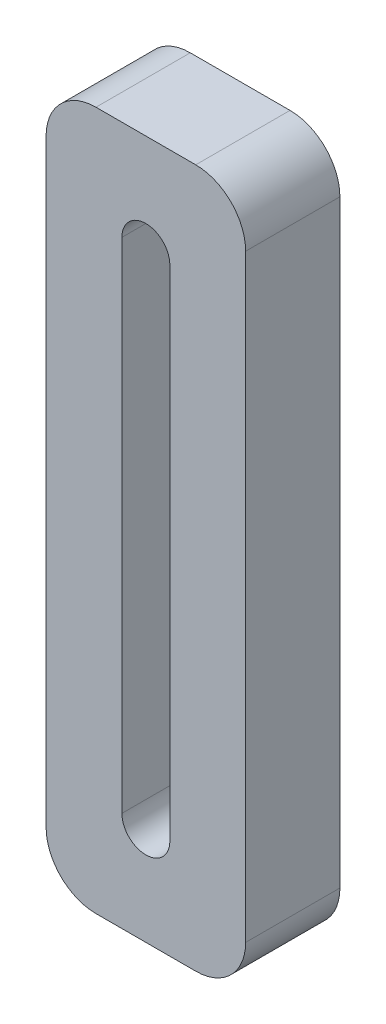
ISO-10303-21;
HEADER;
FILE_DESCRIPTION(('STEP AP214'),'2;1');
FILE_NAME('part.step','',(''),(''),'','','');
FILE_SCHEMA(('AUTOMOTIVE_DESIGN { 1 0 10303 214 1 1 1 1 }'));
ENDSEC;
DATA;
#1=APPLICATION_CONTEXT('core data for automotive mechanical design processes');
#2=APPLICATION_PROTOCOL_DEFINITION('international standard','automotive_design',2000,#1);
#3=PRODUCT_CONTEXT('',#1,'mechanical');
#4=PRODUCT('Part','Part','',(#3));
#5=PRODUCT_RELATED_PRODUCT_CATEGORY('part','',(#4));
#6=PRODUCT_DEFINITION_FORMATION('','',#4);
#7=PRODUCT_DEFINITION_CONTEXT('part definition',#1,'design');
#8=PRODUCT_DEFINITION('design','',#6,#7);
#9=PRODUCT_DEFINITION_SHAPE('','',#8);
#10=(LENGTH_UNIT() NAMED_UNIT(*) SI_UNIT(.MILLI.,.METRE.));
#11=(NAMED_UNIT(*) PLANE_ANGLE_UNIT() SI_UNIT($,.RADIAN.));
#12=(NAMED_UNIT(*) SI_UNIT($,.STERADIAN.) SOLID_ANGLE_UNIT());
#13=UNCERTAINTY_MEASURE_WITH_UNIT(LENGTH_MEASURE(1.E-05),#10,'distance_accuracy_value','');
#14=(GEOMETRIC_REPRESENTATION_CONTEXT(3) GLOBAL_UNCERTAINTY_ASSIGNED_CONTEXT((#13)) GLOBAL_UNIT_ASSIGNED_CONTEXT((#10,
#11,#12)) REPRESENTATION_CONTEXT('',''));
#15=CARTESIAN_POINT('',(0.,0.,0.));
#16=DIRECTION('',(0.,0.,1.));
#17=DIRECTION('',(1.,0.,0.));
#18=AXIS2_PLACEMENT_3D('',#15,#16,#17);
#19=CARTESIAN_POINT('',(0.,0.,3.));
#20=DIRECTION('',(0.,0.,-1.));
#21=DIRECTION('',(-1.,0.,0.));
#22=AXIS2_PLACEMENT_3D('',#19,#20,#21);
#23=PLANE('',#22);
#24=DIRECTION('',(1.,0.,0.));
#25=VECTOR('',#24,1.);
#26=CARTESIAN_POINT('',(-6.35,-22.225,3.));
#27=LINE('',#26,#25);
#28=CARTESIAN_POINT('',(-3.175,-22.225,3.));
#29=VERTEX_POINT('',#28);
#30=CARTESIAN_POINT('',(3.175,-22.225,3.));
#31=VERTEX_POINT('',#30);
#32=EDGE_CURVE('E185',#29,#31,#27,.T.);
#33=ORIENTED_EDGE('',*,*,#32,.T.);
#34=CARTESIAN_POINT('',(3.175,-19.05,3.));
#35=DIRECTION('',(0.,0.,-1.));
#36=DIRECTION('',(-1.,0.,0.));
#37=AXIS2_PLACEMENT_3D('',#34,#35,#36);
#38=CIRCLE('',#37,3.175);
#39=CARTESIAN_POINT('',(6.35,-19.05,3.));
#40=VERTEX_POINT('',#39);
#41=EDGE_CURVE('E220',#31,#40,#38,.F.);
#42=ORIENTED_EDGE('',*,*,#41,.T.);
#43=DIRECTION('',(0.,1.,0.));
#44=VECTOR('',#43,1.);
#45=CARTESIAN_POINT('',(6.35,-22.225,3.));
#46=LINE('',#45,#44);
#47=CARTESIAN_POINT('',(6.35,19.05,3.));
#48=VERTEX_POINT('',#47);
#49=EDGE_CURVE('E196',#40,#48,#46,.T.);
#50=ORIENTED_EDGE('',*,*,#49,.T.);
#51=CARTESIAN_POINT('',(3.175,19.05,3.));
#52=DIRECTION('',(0.,0.,-1.));
#53=DIRECTION('',(-1.,0.,0.));
#54=AXIS2_PLACEMENT_3D('',#51,#52,#53);
#55=CIRCLE('',#54,3.175);
#56=CARTESIAN_POINT('',(3.175,22.225,3.));
#57=VERTEX_POINT('',#56);
#58=EDGE_CURVE('E221',#48,#57,#55,.F.);
#59=ORIENTED_EDGE('',*,*,#58,.T.);
#60=DIRECTION('',(-1.,0.,0.));
#61=VECTOR('',#60,1.);
#62=CARTESIAN_POINT('',(-6.35,22.225,3.));
#63=LINE('',#62,#61);
#64=CARTESIAN_POINT('',(-3.175,22.225,3.));
#65=VERTEX_POINT('',#64);
#66=EDGE_CURVE('E186',#57,#65,#63,.T.);
#67=ORIENTED_EDGE('',*,*,#66,.T.);
#68=CARTESIAN_POINT('',(-3.175,19.05,3.));
#69=DIRECTION('',(0.,0.,-1.));
#70=DIRECTION('',(-1.,0.,0.));
#71=AXIS2_PLACEMENT_3D('',#68,#69,#70);
#72=CIRCLE('',#71,3.175);
#73=CARTESIAN_POINT('',(-6.35,19.05,3.));
#74=VERTEX_POINT('',#73);
#75=EDGE_CURVE('E69',#65,#74,#72,.F.);
#76=ORIENTED_EDGE('',*,*,#75,.T.);
#77=DIRECTION('',(0.,-1.,0.));
#78=VECTOR('',#77,1.);
#79=CARTESIAN_POINT('',(-6.35,-22.225,3.));
#80=LINE('',#79,#78);
#81=CARTESIAN_POINT('',(-6.35,-19.05,3.));
#82=VERTEX_POINT('',#81);
#83=EDGE_CURVE('E181',#74,#82,#80,.T.);
#84=ORIENTED_EDGE('',*,*,#83,.T.);
#85=CARTESIAN_POINT('',(-3.175,-19.05,3.));
#86=DIRECTION('',(0.,0.,-1.));
#87=DIRECTION('',(-1.,0.,0.));
#88=AXIS2_PLACEMENT_3D('',#85,#86,#87);
#89=CIRCLE('',#88,3.175);
#90=EDGE_CURVE('E219',#82,#29,#89,.F.);
#91=ORIENTED_EDGE('',*,*,#90,.T.);
#92=EDGE_LOOP('',(#33,#42,#50,#59,#67,#76,#84,#91));
#93=FACE_BOUND('',#92,.T.);
#94=CARTESIAN_POINT('',(0.,15.875,3.));
#95=DIRECTION('',(0.,0.,1.));
#96=DIRECTION('',(1.,0.,0.));
#97=AXIS2_PLACEMENT_3D('',#94,#95,#96);
#98=CIRCLE('',#97,1.52690839694655);
#99=CARTESIAN_POINT('',(1.52690839694655,15.875,3.));
#100=VERTEX_POINT('',#99);
#101=CARTESIAN_POINT('',(-1.52690839694655,15.875,3.));
#102=VERTEX_POINT('',#101);
#103=EDGE_CURVE('E139',#100,#102,#98,.T.);
#104=ORIENTED_EDGE('',*,*,#103,.F.);
#105=DIRECTION('',(0.,1.,0.));
#106=VECTOR('',#105,1.);
#107=CARTESIAN_POINT('',(1.52690839694655,15.875,3.));
#108=LINE('',#107,#106);
#109=CARTESIAN_POINT('',(1.52690839694656,-15.875,3.));
#110=VERTEX_POINT('',#109);
#111=EDGE_CURVE('E166',#110,#100,#108,.T.);
#112=ORIENTED_EDGE('',*,*,#111,.F.);
#113=CARTESIAN_POINT('',(0.,-15.875,3.));
#114=DIRECTION('',(0.,0.,1.));
#115=DIRECTION('',(1.,0.,0.));
#116=AXIS2_PLACEMENT_3D('',#113,#114,#115);
#117=CIRCLE('',#116,1.52690839694655);
#118=CARTESIAN_POINT('',(-1.52690839694655,-15.875,3.));
#119=VERTEX_POINT('',#118);
#120=EDGE_CURVE('E163',#119,#110,#117,.T.);
#121=ORIENTED_EDGE('',*,*,#120,.F.);
#122=DIRECTION('',(0.,-1.,0.));
#123=VECTOR('',#122,1.);
#124=CARTESIAN_POINT('',(-1.52690839694655,15.875,3.));
#125=LINE('',#124,#123);
#126=EDGE_CURVE('E150',#102,#119,#125,.T.);
#127=ORIENTED_EDGE('',*,*,#126,.F.);
#128=EDGE_LOOP('',(#104,#112,#121,#127));
#129=FACE_BOUND('',#128,.T.);
#130=ADVANCED_FACE('F47',(#93,#129),#23,.F.);
#131=CARTESIAN_POINT('',(0.,0.,-3.));
#132=DIRECTION('',(0.,0.,-1.));
#133=DIRECTION('',(-1.,0.,0.));
#134=AXIS2_PLACEMENT_3D('',#131,#132,#133);
#135=PLANE('',#134);
#136=DIRECTION('',(0.,1.,0.));
#137=VECTOR('',#136,1.);
#138=CARTESIAN_POINT('',(6.35,-22.225,-3.));
#139=LINE('',#138,#137);
#140=CARTESIAN_POINT('',(6.35,-19.05,-3.));
#141=VERTEX_POINT('',#140);
#142=CARTESIAN_POINT('',(6.35,19.05,-3.));
#143=VERTEX_POINT('',#142);
#144=EDGE_CURVE('E158',#141,#143,#139,.T.);
#145=ORIENTED_EDGE('',*,*,#144,.F.);
#146=CARTESIAN_POINT('',(3.175,-19.05,-3.));
#147=DIRECTION('',(0.,0.,-1.));
#148=DIRECTION('',(-1.,0.,0.));
#149=AXIS2_PLACEMENT_3D('',#146,#147,#148);
#150=CIRCLE('',#149,3.175);
#151=CARTESIAN_POINT('',(3.175,-22.225,-3.));
#152=VERTEX_POINT('',#151);
#153=EDGE_CURVE('E268',#141,#152,#150,.T.);
#154=ORIENTED_EDGE('',*,*,#153,.T.);
#155=DIRECTION('',(1.,0.,0.));
#156=VECTOR('',#155,1.);
#157=CARTESIAN_POINT('',(-6.35,-22.225,-3.));
#158=LINE('',#157,#156);
#159=CARTESIAN_POINT('',(-3.175,-22.225,-3.));
#160=VERTEX_POINT('',#159);
#161=EDGE_CURVE('E200',#160,#152,#158,.T.);
#162=ORIENTED_EDGE('',*,*,#161,.F.);
#163=CARTESIAN_POINT('',(-3.175,-19.05,-3.));
#164=DIRECTION('',(0.,0.,-1.));
#165=DIRECTION('',(-1.,0.,0.));
#166=AXIS2_PLACEMENT_3D('',#163,#164,#165);
#167=CIRCLE('',#166,3.175);
#168=CARTESIAN_POINT('',(-6.35,-19.05,-3.));
#169=VERTEX_POINT('',#168);
#170=EDGE_CURVE('E255',#160,#169,#167,.T.);
#171=ORIENTED_EDGE('',*,*,#170,.T.);
#172=DIRECTION('',(0.,-1.,0.));
#173=VECTOR('',#172,1.);
#174=CARTESIAN_POINT('',(-6.35,-22.225,-3.));
#175=LINE('',#174,#173);
#176=CARTESIAN_POINT('',(-6.35,19.05,-3.));
#177=VERTEX_POINT('',#176);
#178=EDGE_CURVE('E251',#177,#169,#175,.T.);
#179=ORIENTED_EDGE('',*,*,#178,.F.);
#180=CARTESIAN_POINT('',(-3.175,19.05,-3.));
#181=DIRECTION('',(0.,0.,-1.));
#182=DIRECTION('',(-1.,0.,0.));
#183=AXIS2_PLACEMENT_3D('',#180,#181,#182);
#184=CIRCLE('',#183,3.175);
#185=CARTESIAN_POINT('',(-3.175,22.225,-3.));
#186=VERTEX_POINT('',#185);
#187=EDGE_CURVE('E248',#177,#186,#184,.T.);
#188=ORIENTED_EDGE('',*,*,#187,.T.);
#189=DIRECTION('',(-1.,0.,0.));
#190=VECTOR('',#189,1.);
#191=CARTESIAN_POINT('',(-6.35,22.225,-3.));
#192=LINE('',#191,#190);
#193=CARTESIAN_POINT('',(3.175,22.225,-3.));
#194=VERTEX_POINT('',#193);
#195=EDGE_CURVE('E244',#194,#186,#192,.T.);
#196=ORIENTED_EDGE('',*,*,#195,.F.);
#197=CARTESIAN_POINT('',(3.175,19.05,-3.));
#198=DIRECTION('',(0.,0.,-1.));
#199=DIRECTION('',(-1.,0.,0.));
#200=AXIS2_PLACEMENT_3D('',#197,#198,#199);
#201=CIRCLE('',#200,3.175);
#202=EDGE_CURVE('E265',#194,#143,#201,.T.);
#203=ORIENTED_EDGE('',*,*,#202,.T.);
#204=EDGE_LOOP('',(#145,#154,#162,#171,#179,#188,#196,#203));
#205=FACE_BOUND('',#204,.T.);
#206=DIRECTION('',(0.,1.,0.));
#207=VECTOR('',#206,1.);
#208=CARTESIAN_POINT('',(1.52690839694655,15.875,-3.));
#209=LINE('',#208,#207);
#210=CARTESIAN_POINT('',(1.52690839694656,-15.875,-3.));
#211=VERTEX_POINT('',#210);
#212=CARTESIAN_POINT('',(1.52690839694655,15.875,-3.));
#213=VERTEX_POINT('',#212);
#214=EDGE_CURVE('E151',#211,#213,#209,.T.);
#215=ORIENTED_EDGE('',*,*,#214,.T.);
#216=CARTESIAN_POINT('',(0.,15.875,-3.));
#217=DIRECTION('',(0.,0.,1.));
#218=DIRECTION('',(1.,0.,0.));
#219=AXIS2_PLACEMENT_3D('',#216,#217,#218);
#220=CIRCLE('',#219,1.52690839694655);
#221=CARTESIAN_POINT('',(-1.52690839694655,15.875,-3.));
#222=VERTEX_POINT('',#221);
#223=EDGE_CURVE('E211',#213,#222,#220,.T.);
#224=ORIENTED_EDGE('',*,*,#223,.T.);
#225=DIRECTION('',(0.,-1.,0.));
#226=VECTOR('',#225,1.);
#227=CARTESIAN_POINT('',(-1.52690839694655,15.875,-3.));
#228=LINE('',#227,#226);
#229=CARTESIAN_POINT('',(-1.52690839694655,-15.875,-3.));
#230=VERTEX_POINT('',#229);
#231=EDGE_CURVE('E157',#222,#230,#228,.T.);
#232=ORIENTED_EDGE('',*,*,#231,.T.);
#233=CARTESIAN_POINT('',(0.,-15.875,-3.));
#234=DIRECTION('',(0.,0.,1.));
#235=DIRECTION('',(1.,0.,0.));
#236=AXIS2_PLACEMENT_3D('',#233,#234,#235);
#237=CIRCLE('',#236,1.52690839694655);
#238=EDGE_CURVE('E208',#230,#211,#237,.T.);
#239=ORIENTED_EDGE('',*,*,#238,.T.);
#240=EDGE_LOOP('',(#215,#224,#232,#239));
#241=FACE_BOUND('',#240,.T.);
#242=ADVANCED_FACE('F213',(#205,#241),#135,.T.);
#243=CARTESIAN_POINT('',(6.35,-22.225,3.));
#244=DIRECTION('',(-1.,0.,0.));
#245=DIRECTION('',(0.,0.,1.));
#246=AXIS2_PLACEMENT_3D('',#243,#244,#245);
#247=PLANE('',#246);
#248=ORIENTED_EDGE('',*,*,#49,.F.);
#249=DIRECTION('',(0.,0.,-1.));
#250=VECTOR('',#249,1.);
#251=CARTESIAN_POINT('',(6.35,-19.05,3.));
#252=LINE('',#251,#250);
#253=EDGE_CURVE('E261',#40,#141,#252,.T.);
#254=ORIENTED_EDGE('',*,*,#253,.T.);
#255=ORIENTED_EDGE('',*,*,#144,.T.);
#256=DIRECTION('',(0.,0.,-1.));
#257=VECTOR('',#256,1.);
#258=CARTESIAN_POINT('',(6.35,19.05,3.));
#259=LINE('',#258,#257);
#260=EDGE_CURVE('E193',#143,#48,#259,.F.);
#261=ORIENTED_EDGE('',*,*,#260,.T.);
#262=EDGE_LOOP('',(#248,#254,#255,#261));
#263=FACE_BOUND('',#262,.T.);
#264=ADVANCED_FACE('F284',(#263),#247,.F.);
#265=CARTESIAN_POINT('',(-6.35,22.225,3.));
#266=DIRECTION('',(0.,-1.,0.));
#267=DIRECTION('',(0.,0.,-1.));
#268=AXIS2_PLACEMENT_3D('',#265,#266,#267);
#269=PLANE('',#268);
#270=ORIENTED_EDGE('',*,*,#66,.F.);
#271=DIRECTION('',(0.,0.,-1.));
#272=VECTOR('',#271,1.);
#273=CARTESIAN_POINT('',(3.175,22.225,3.));
#274=LINE('',#273,#272);
#275=EDGE_CURVE('E12',#57,#194,#274,.T.);
#276=ORIENTED_EDGE('',*,*,#275,.T.);
#277=ORIENTED_EDGE('',*,*,#195,.T.);
#278=DIRECTION('',(0.,0.,-1.));
#279=VECTOR('',#278,1.);
#280=CARTESIAN_POINT('',(-3.175,22.225,3.));
#281=LINE('',#280,#279);
#282=EDGE_CURVE('E55',#186,#65,#281,.F.);
#283=ORIENTED_EDGE('',*,*,#282,.T.);
#284=EDGE_LOOP('',(#270,#276,#277,#283));
#285=FACE_BOUND('',#284,.T.);
#286=ADVANCED_FACE('F241',(#285),#269,.F.);
#287=CARTESIAN_POINT('',(-6.35,-22.225,3.));
#288=DIRECTION('',(1.,0.,0.));
#289=DIRECTION('',(0.,0.,-1.));
#290=AXIS2_PLACEMENT_3D('',#287,#288,#289);
#291=PLANE('',#290);
#292=ORIENTED_EDGE('',*,*,#178,.T.);
#293=DIRECTION('',(0.,0.,-1.));
#294=VECTOR('',#293,1.);
#295=CARTESIAN_POINT('',(-6.35,-19.05,3.));
#296=LINE('',#295,#294);
#297=EDGE_CURVE('E62',#169,#82,#296,.F.);
#298=ORIENTED_EDGE('',*,*,#297,.T.);
#299=ORIENTED_EDGE('',*,*,#83,.F.);
#300=DIRECTION('',(0.,0.,-1.));
#301=VECTOR('',#300,1.);
#302=CARTESIAN_POINT('',(-6.35,19.05,3.));
#303=LINE('',#302,#301);
#304=EDGE_CURVE('E230',#74,#177,#303,.T.);
#305=ORIENTED_EDGE('',*,*,#304,.T.);
#306=EDGE_LOOP('',(#292,#298,#299,#305));
#307=FACE_BOUND('',#306,.T.);
#308=ADVANCED_FACE('F250',(#307),#291,.F.);
#309=CARTESIAN_POINT('',(-6.35,-22.225,3.));
#310=DIRECTION('',(0.,1.,0.));
#311=DIRECTION('',(0.,0.,1.));
#312=AXIS2_PLACEMENT_3D('',#309,#310,#311);
#313=PLANE('',#312);
#314=ORIENTED_EDGE('',*,*,#161,.T.);
#315=DIRECTION('',(0.,0.,-1.));
#316=VECTOR('',#315,1.);
#317=CARTESIAN_POINT('',(3.175,-22.225,3.));
#318=LINE('',#317,#316);
#319=EDGE_CURVE('E225',#152,#31,#318,.F.);
#320=ORIENTED_EDGE('',*,*,#319,.T.);
#321=ORIENTED_EDGE('',*,*,#32,.F.);
#322=DIRECTION('',(0.,0.,-1.));
#323=VECTOR('',#322,1.);
#324=CARTESIAN_POINT('',(-3.175,-22.225,3.));
#325=LINE('',#324,#323);
#326=EDGE_CURVE('E270',#29,#160,#325,.T.);
#327=ORIENTED_EDGE('',*,*,#326,.T.);
#328=EDGE_LOOP('',(#314,#320,#321,#327));
#329=FACE_BOUND('',#328,.T.);
#330=ADVANCED_FACE('F276',(#329),#313,.F.);
#331=CARTESIAN_POINT('',(0.,15.875,3.));
#332=DIRECTION('',(0.,0.,-1.));
#333=DIRECTION('',(-1.,0.,0.));
#334=AXIS2_PLACEMENT_3D('',#331,#332,#333);
#335=CYLINDRICAL_SURFACE('',#334,1.52690839694655);
#336=ORIENTED_EDGE('',*,*,#223,.F.);
#337=DIRECTION('',(0.,0.,-1.));
#338=VECTOR('',#337,1.);
#339=CARTESIAN_POINT('',(1.52690839694655,15.875,3.));
#340=LINE('',#339,#338);
#341=EDGE_CURVE('E145',#100,#213,#340,.T.);
#342=ORIENTED_EDGE('',*,*,#341,.F.);
#343=ORIENTED_EDGE('',*,*,#103,.T.);
#344=DIRECTION('',(0.,0.,-1.));
#345=VECTOR('',#344,1.);
#346=CARTESIAN_POINT('',(-1.52690839694655,15.875,3.));
#347=LINE('',#346,#345);
#348=EDGE_CURVE('E142',#102,#222,#347,.T.);
#349=ORIENTED_EDGE('',*,*,#348,.T.);
#350=EDGE_LOOP('',(#336,#342,#343,#349));
#351=FACE_BOUND('',#350,.T.);
#352=ADVANCED_FACE('F141',(#351),#335,.F.);
#353=CARTESIAN_POINT('',(-1.52690839694655,15.875,3.));
#354=DIRECTION('',(1.,0.,0.));
#355=DIRECTION('',(0.,1.,0.));
#356=AXIS2_PLACEMENT_3D('',#353,#354,#355);
#357=PLANE('',#356);
#358=ORIENTED_EDGE('',*,*,#231,.F.);
#359=ORIENTED_EDGE('',*,*,#348,.F.);
#360=ORIENTED_EDGE('',*,*,#126,.T.);
#361=DIRECTION('',(0.,0.,-1.));
#362=VECTOR('',#361,1.);
#363=CARTESIAN_POINT('',(-1.52690839694655,-15.875,3.));
#364=LINE('',#363,#362);
#365=EDGE_CURVE('E159',#119,#230,#364,.T.);
#366=ORIENTED_EDGE('',*,*,#365,.T.);
#367=EDGE_LOOP('',(#358,#359,#360,#366));
#368=FACE_BOUND('',#367,.T.);
#369=ADVANCED_FACE('F154',(#368),#357,.T.);
#370=CARTESIAN_POINT('',(0.,-15.875,3.));
#371=DIRECTION('',(0.,0.,-1.));
#372=DIRECTION('',(-1.,0.,0.));
#373=AXIS2_PLACEMENT_3D('',#370,#371,#372);
#374=CYLINDRICAL_SURFACE('',#373,1.52690839694655);
#375=ORIENTED_EDGE('',*,*,#238,.F.);
#376=ORIENTED_EDGE('',*,*,#365,.F.);
#377=ORIENTED_EDGE('',*,*,#120,.T.);
#378=DIRECTION('',(0.,0.,-1.));
#379=VECTOR('',#378,1.);
#380=CARTESIAN_POINT('',(1.52690839694656,-15.875,3.));
#381=LINE('',#380,#379);
#382=EDGE_CURVE('E203',#110,#211,#381,.T.);
#383=ORIENTED_EDGE('',*,*,#382,.T.);
#384=EDGE_LOOP('',(#375,#376,#377,#383));
#385=FACE_BOUND('',#384,.T.);
#386=ADVANCED_FACE('F317',(#385),#374,.F.);
#387=CARTESIAN_POINT('',(1.52690839694655,15.875,3.));
#388=DIRECTION('',(-1.,0.,0.));
#389=DIRECTION('',(0.,-1.,0.));
#390=AXIS2_PLACEMENT_3D('',#387,#388,#389);
#391=PLANE('',#390);
#392=ORIENTED_EDGE('',*,*,#214,.F.);
#393=ORIENTED_EDGE('',*,*,#382,.F.);
#394=ORIENTED_EDGE('',*,*,#111,.T.);
#395=ORIENTED_EDGE('',*,*,#341,.T.);
#396=EDGE_LOOP('',(#392,#393,#394,#395));
#397=FACE_BOUND('',#396,.T.);
#398=ADVANCED_FACE('F216',(#397),#391,.T.);
#399=CARTESIAN_POINT('',(3.175,-19.05,3.));
#400=DIRECTION('',(0.,0.,-1.));
#401=DIRECTION('',(-1.,0.,0.));
#402=AXIS2_PLACEMENT_3D('',#399,#400,#401);
#403=CYLINDRICAL_SURFACE('',#402,3.175);
#404=ORIENTED_EDGE('',*,*,#41,.F.);
#405=ORIENTED_EDGE('',*,*,#319,.F.);
#406=ORIENTED_EDGE('',*,*,#153,.F.);
#407=ORIENTED_EDGE('',*,*,#253,.F.);
#408=EDGE_LOOP('',(#404,#405,#406,#407));
#409=FACE_BOUND('',#408,.T.);
#410=ADVANCED_FACE('F281',(#409),#403,.T.);
#411=CARTESIAN_POINT('',(-3.175,-19.05,3.));
#412=DIRECTION('',(0.,0.,-1.));
#413=DIRECTION('',(-1.,0.,0.));
#414=AXIS2_PLACEMENT_3D('',#411,#412,#413);
#415=CYLINDRICAL_SURFACE('',#414,3.175);
#416=ORIENTED_EDGE('',*,*,#90,.F.);
#417=ORIENTED_EDGE('',*,*,#297,.F.);
#418=ORIENTED_EDGE('',*,*,#170,.F.);
#419=ORIENTED_EDGE('',*,*,#326,.F.);
#420=EDGE_LOOP('',(#416,#417,#418,#419));
#421=FACE_BOUND('',#420,.T.);
#422=ADVANCED_FACE('F289',(#421),#415,.T.);
#423=CARTESIAN_POINT('',(3.175,19.05,3.));
#424=DIRECTION('',(0.,0.,-1.));
#425=DIRECTION('',(-1.,0.,0.));
#426=AXIS2_PLACEMENT_3D('',#423,#424,#425);
#427=CYLINDRICAL_SURFACE('',#426,3.175);
#428=ORIENTED_EDGE('',*,*,#58,.F.);
#429=ORIENTED_EDGE('',*,*,#260,.F.);
#430=ORIENTED_EDGE('',*,*,#202,.F.);
#431=ORIENTED_EDGE('',*,*,#275,.F.);
#432=EDGE_LOOP('',(#428,#429,#430,#431));
#433=FACE_BOUND('',#432,.T.);
#434=ADVANCED_FACE('F287',(#433),#427,.T.);
#435=CARTESIAN_POINT('',(-3.175,19.05,3.));
#436=DIRECTION('',(0.,0.,-1.));
#437=DIRECTION('',(-1.,0.,0.));
#438=AXIS2_PLACEMENT_3D('',#435,#436,#437);
#439=CYLINDRICAL_SURFACE('',#438,3.175);
#440=ORIENTED_EDGE('',*,*,#75,.F.);
#441=ORIENTED_EDGE('',*,*,#282,.F.);
#442=ORIENTED_EDGE('',*,*,#187,.F.);
#443=ORIENTED_EDGE('',*,*,#304,.F.);
#444=EDGE_LOOP('',(#440,#441,#442,#443));
#445=FACE_BOUND('',#444,.T.);
#446=ADVANCED_FACE('F49',(#445),#439,.T.);
#447=CLOSED_SHELL('',(#130,#242,#264,#286,#308,#330,#352,#369,#386,#398,#410,#422,#434,#446));
#448=MANIFOLD_SOLID_BREP('B2',#447);
#449=ADVANCED_BREP_SHAPE_REPRESENTATION('',(#18,#448),#14);
#450=SHAPE_DEFINITION_REPRESENTATION(#9,#449);
ENDSEC;
END-ISO-10303-21;
